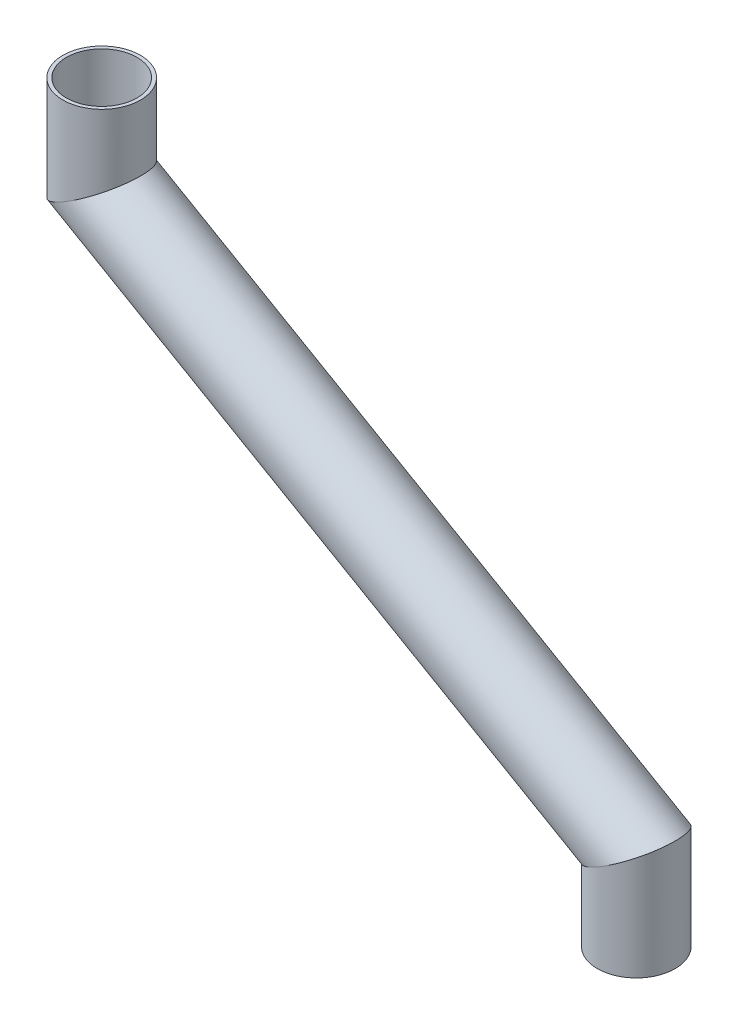
ISO-10303-21;
HEADER;
FILE_DESCRIPTION(('STEP AP214'),'2;1');
FILE_NAME('part.step','',(''),(''),'','','');
FILE_SCHEMA(('AUTOMOTIVE_DESIGN { 1 0 10303 214 1 1 1 1 }'));
ENDSEC;
DATA;
#1=APPLICATION_CONTEXT('core data for automotive mechanical design processes');
#2=APPLICATION_PROTOCOL_DEFINITION('international standard','automotive_design',2000,#1);
#3=PRODUCT_CONTEXT('',#1,'mechanical');
#4=PRODUCT('Part','Part','',(#3));
#5=PRODUCT_RELATED_PRODUCT_CATEGORY('part','',(#4));
#6=PRODUCT_DEFINITION_FORMATION('','',#4);
#7=PRODUCT_DEFINITION_CONTEXT('part definition',#1,'design');
#8=PRODUCT_DEFINITION('design','',#6,#7);
#9=PRODUCT_DEFINITION_SHAPE('','',#8);
#10=(LENGTH_UNIT() NAMED_UNIT(*) SI_UNIT(.MILLI.,.METRE.));
#11=(NAMED_UNIT(*) PLANE_ANGLE_UNIT() SI_UNIT($,.RADIAN.));
#12=(NAMED_UNIT(*) SI_UNIT($,.STERADIAN.) SOLID_ANGLE_UNIT());
#13=UNCERTAINTY_MEASURE_WITH_UNIT(LENGTH_MEASURE(1.E-05),#10,'distance_accuracy_value','');
#14=(GEOMETRIC_REPRESENTATION_CONTEXT(3) GLOBAL_UNCERTAINTY_ASSIGNED_CONTEXT((#13)) GLOBAL_UNIT_ASSIGNED_CONTEXT((#10,
#11,#12)) REPRESENTATION_CONTEXT('',''));
#15=CARTESIAN_POINT('',(0.,0.,0.));
#16=DIRECTION('',(0.,0.,1.));
#17=DIRECTION('',(1.,0.,0.));
#18=AXIS2_PLACEMENT_3D('',#15,#16,#17);
#19=CARTESIAN_POINT('',(0.,-20.4382855903135,0.));
#20=DIRECTION('',(0.,1.,0.));
#21=DIRECTION('',(-1.,0.,0.));
#22=AXIS2_PLACEMENT_3D('',#19,#20,#21);
#23=CYLINDRICAL_SURFACE('',#22,22.);
#24=CARTESIAN_POINT('',(0.,7.60546743846433,0.));
#25=DIRECTION('',(-0.5,0.866025403784439,0.));
#26=DIRECTION('',(-0.866025403784439,-0.5,0.));
#27=AXIS2_PLACEMENT_3D('',#24,#25,#26);
#28=ELLIPSE('',#27,25.4034118443435,22.);
#29=CARTESIAN_POINT('',(-22.,-5.09623848370742,0.));
#30=VERTEX_POINT('',#29);
#31=EDGE_CURVE('E36',#30,#30,#28,.F.);
#32=ORIENTED_EDGE('',*,*,#31,.F.);
#33=EDGE_LOOP('',(#32));
#34=FACE_BOUND('',#33,.T.);
#35=CARTESIAN_POINT('',(0.,57.6054674384644,0.));
#36=DIRECTION('',(0.,1.,0.));
#37=DIRECTION('',(0.,0.,1.));
#38=AXIS2_PLACEMENT_3D('',#35,#36,#37);
#39=CIRCLE('',#38,22.);
#40=CARTESIAN_POINT('',(0.,57.6054674384644,22.));
#41=VERTEX_POINT('',#40);
#42=EDGE_CURVE('E47',#41,#41,#39,.T.);
#43=ORIENTED_EDGE('',*,*,#42,.F.);
#44=EDGE_LOOP('',(#43));
#45=FACE_BOUND('',#44,.T.);
#46=ADVANCED_FACE('F33',(#34,#45),#23,.T.);
#47=CARTESIAN_POINT('',(327.395493864932,-181.416409075925,0.));
#48=DIRECTION('',(-0.866025403784438,0.500000000000001,0.));
#49=DIRECTION('',(-0.500000000000001,-0.866025403784438,0.));
#50=AXIS2_PLACEMENT_3D('',#47,#48,#49);
#51=CYLINDRICAL_SURFACE('',#50,22.);
#52=CARTESIAN_POINT('',(303.108891324553,-167.394532561536,0.));
#53=DIRECTION('',(-0.5,0.866025403784439,0.));
#54=DIRECTION('',(0.866025403784439,0.5,0.));
#55=AXIS2_PLACEMENT_3D('',#52,#53,#54);
#56=ELLIPSE('',#55,25.4034118443435,22.);
#57=CARTESIAN_POINT('',(325.108891324553,-154.692826639364,0.));
#58=VERTEX_POINT('',#57);
#59=EDGE_CURVE('E86',#58,#58,#56,.F.);
#60=ORIENTED_EDGE('',*,*,#59,.F.);
#61=EDGE_LOOP('',(#60));
#62=FACE_BOUND('',#61,.T.);
#63=ORIENTED_EDGE('',*,*,#31,.T.);
#64=EDGE_LOOP('',(#63));
#65=FACE_BOUND('',#64,.T.);
#66=ADVANCED_FACE('F90',(#62,#65),#51,.T.);
#67=CARTESIAN_POINT('',(303.108891324553,-217.394532561536,0.));
#68=DIRECTION('',(0.,1.,0.));
#69=DIRECTION('',(0.,0.,1.));
#70=AXIS2_PLACEMENT_3D('',#67,#68,#69);
#71=CYLINDRICAL_SURFACE('',#70,22.);
#72=CARTESIAN_POINT('',(303.108891324553,-217.394532561536,0.));
#73=DIRECTION('',(0.,1.,0.));
#74=DIRECTION('',(0.,0.,1.));
#75=AXIS2_PLACEMENT_3D('',#72,#73,#74);
#76=CIRCLE('',#75,22.);
#77=CARTESIAN_POINT('',(303.108891324553,-217.394532561536,22.));
#78=VERTEX_POINT('',#77);
#79=EDGE_CURVE('E53',#78,#78,#76,.T.);
#80=ORIENTED_EDGE('',*,*,#79,.T.);
#81=EDGE_LOOP('',(#80));
#82=FACE_BOUND('',#81,.T.);
#83=ORIENTED_EDGE('',*,*,#59,.T.);
#84=EDGE_LOOP('',(#83));
#85=FACE_BOUND('',#84,.T.);
#86=ADVANCED_FACE('F92',(#82,#85),#71,.T.);
#87=CARTESIAN_POINT('',(0.,57.6054674384644,0.));
#88=DIRECTION('',(0.,1.,0.));
#89=DIRECTION('',(0.,0.,1.));
#90=AXIS2_PLACEMENT_3D('',#87,#88,#89);
#91=PLANE('',#90);
#92=CARTESIAN_POINT('',(0.,57.6054674384644,0.));
#93=DIRECTION('',(0.,1.,0.));
#94=DIRECTION('',(0.,0.,1.));
#95=AXIS2_PLACEMENT_3D('',#92,#93,#94);
#96=CIRCLE('',#95,20.);
#97=CARTESIAN_POINT('',(0.,57.6054674384644,20.));
#98=VERTEX_POINT('',#97);
#99=EDGE_CURVE('E79',#98,#98,#96,.F.);
#100=ORIENTED_EDGE('',*,*,#99,.T.);
#101=EDGE_LOOP('',(#100));
#102=FACE_BOUND('',#101,.T.);
#103=ORIENTED_EDGE('',*,*,#42,.T.);
#104=EDGE_LOOP('',(#103));
#105=FACE_BOUND('',#104,.T.);
#106=ADVANCED_FACE('F98',(#102,#105),#91,.T.);
#107=CARTESIAN_POINT('',(303.108891324553,-217.394532561536,0.));
#108=DIRECTION('',(0.,1.,0.));
#109=DIRECTION('',(0.,0.,1.));
#110=AXIS2_PLACEMENT_3D('',#107,#108,#109);
#111=PLANE('',#110);
#112=CARTESIAN_POINT('',(303.108891324553,-217.394532561536,0.));
#113=DIRECTION('',(0.,1.,0.));
#114=DIRECTION('',(0.,0.,1.));
#115=AXIS2_PLACEMENT_3D('',#112,#113,#114);
#116=CIRCLE('',#115,20.);
#117=CARTESIAN_POINT('',(303.108891324553,-217.394532561536,20.));
#118=VERTEX_POINT('',#117);
#119=EDGE_CURVE('E41',#118,#118,#116,.F.);
#120=ORIENTED_EDGE('',*,*,#119,.F.);
#121=EDGE_LOOP('',(#120));
#122=FACE_BOUND('',#121,.T.);
#123=ORIENTED_EDGE('',*,*,#79,.F.);
#124=EDGE_LOOP('',(#123));
#125=FACE_BOUND('',#124,.T.);
#126=ADVANCED_FACE('F113',(#122,#125),#111,.F.);
#127=CARTESIAN_POINT('',(0.,-17.8979444058791,0.));
#128=DIRECTION('',(0.,1.,0.));
#129=DIRECTION('',(-1.,0.,0.));
#130=AXIS2_PLACEMENT_3D('',#127,#128,#129);
#131=CYLINDRICAL_SURFACE('',#130,20.);
#132=CARTESIAN_POINT('',(0.,7.60546743846433,0.));
#133=DIRECTION('',(-0.5,0.866025403784439,0.));
#134=DIRECTION('',(-0.866025403784439,-0.5,0.));
#135=AXIS2_PLACEMENT_3D('',#132,#133,#134);
#136=ELLIPSE('',#135,23.094010767585,20.);
#137=CARTESIAN_POINT('',(-20.,-3.94153794532818,0.));
#138=VERTEX_POINT('',#137);
#139=EDGE_CURVE('E75',#138,#138,#136,.T.);
#140=ORIENTED_EDGE('',*,*,#139,.F.);
#141=EDGE_LOOP('',(#140));
#142=FACE_BOUND('',#141,.T.);
#143=ORIENTED_EDGE('',*,*,#99,.F.);
#144=EDGE_LOOP('',(#143));
#145=FACE_BOUND('',#144,.T.);
#146=ADVANCED_FACE('F76',(#142,#145),#131,.F.);
#147=CARTESIAN_POINT('',(325.195493864932,-180.146238483708,0.));
#148=DIRECTION('',(-0.866025403784438,0.500000000000001,0.));
#149=DIRECTION('',(-0.500000000000001,-0.866025403784438,0.));
#150=AXIS2_PLACEMENT_3D('',#147,#148,#149);
#151=CYLINDRICAL_SURFACE('',#150,20.);
#152=CARTESIAN_POINT('',(303.108891324553,-167.394532561536,0.));
#153=DIRECTION('',(-0.5,0.866025403784439,0.));
#154=DIRECTION('',(0.866025403784439,0.5,0.));
#155=AXIS2_PLACEMENT_3D('',#152,#153,#154);
#156=ELLIPSE('',#155,23.094010767585,20.);
#157=CARTESIAN_POINT('',(323.108891324553,-155.847527177744,0.));
#158=VERTEX_POINT('',#157);
#159=EDGE_CURVE('E11',#158,#158,#156,.T.);
#160=ORIENTED_EDGE('',*,*,#159,.F.);
#161=EDGE_LOOP('',(#160));
#162=FACE_BOUND('',#161,.T.);
#163=ORIENTED_EDGE('',*,*,#139,.T.);
#164=EDGE_LOOP('',(#163));
#165=FACE_BOUND('',#164,.T.);
#166=ADVANCED_FACE('F102',(#162,#165),#151,.F.);
#167=CARTESIAN_POINT('',(303.108891324553,-217.394532561536,0.));
#168=DIRECTION('',(0.,1.,0.));
#169=DIRECTION('',(0.,0.,1.));
#170=AXIS2_PLACEMENT_3D('',#167,#168,#169);
#171=CYLINDRICAL_SURFACE('',#170,20.);
#172=ORIENTED_EDGE('',*,*,#119,.T.);
#173=EDGE_LOOP('',(#172));
#174=FACE_BOUND('',#173,.T.);
#175=ORIENTED_EDGE('',*,*,#159,.T.);
#176=EDGE_LOOP('',(#175));
#177=FACE_BOUND('',#176,.T.);
#178=ADVANCED_FACE('F100',(#174,#177),#171,.F.);
#179=CLOSED_SHELL('',(#46,#66,#86,#106,#126,#146,#166,#178));
#180=MANIFOLD_SOLID_BREP('B2',#179);
#181=ADVANCED_BREP_SHAPE_REPRESENTATION('',(#18,#180),#14);
#182=SHAPE_DEFINITION_REPRESENTATION(#9,#181);
ENDSEC;
END-ISO-10303-21;
